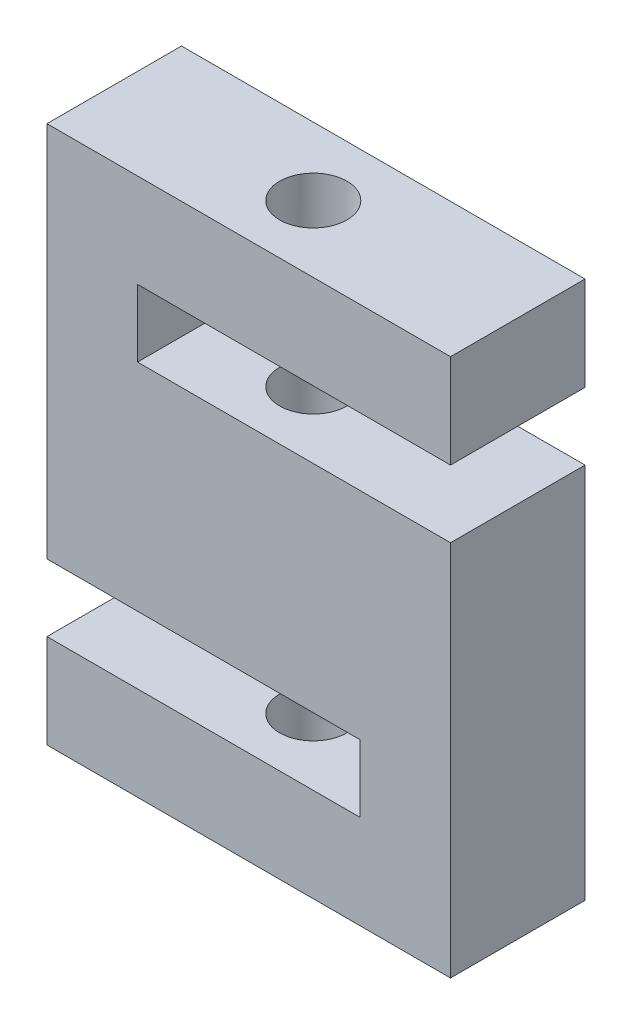
ISO-10303-21;
HEADER;
FILE_DESCRIPTION(('STEP AP214'),'2;1');
FILE_NAME('part.step','',(''),(''),'','','');
FILE_SCHEMA(('AUTOMOTIVE_DESIGN { 1 0 10303 214 1 1 1 1 }'));
ENDSEC;
DATA;
#1=APPLICATION_CONTEXT('core data for automotive mechanical design processes');
#2=APPLICATION_PROTOCOL_DEFINITION('international standard','automotive_design',2000,#1);
#3=PRODUCT_CONTEXT('',#1,'mechanical');
#4=PRODUCT('Part','Part','',(#3));
#5=PRODUCT_RELATED_PRODUCT_CATEGORY('part','',(#4));
#6=PRODUCT_DEFINITION_FORMATION('','',#4);
#7=PRODUCT_DEFINITION_CONTEXT('part definition',#1,'design');
#8=PRODUCT_DEFINITION('design','',#6,#7);
#9=PRODUCT_DEFINITION_SHAPE('','',#8);
#10=(LENGTH_UNIT() NAMED_UNIT(*) SI_UNIT(.MILLI.,.METRE.));
#11=(NAMED_UNIT(*) PLANE_ANGLE_UNIT() SI_UNIT($,.RADIAN.));
#12=(NAMED_UNIT(*) SI_UNIT($,.STERADIAN.) SOLID_ANGLE_UNIT());
#13=UNCERTAINTY_MEASURE_WITH_UNIT(LENGTH_MEASURE(1.E-05),#10,'distance_accuracy_value','');
#14=(GEOMETRIC_REPRESENTATION_CONTEXT(3) GLOBAL_UNCERTAINTY_ASSIGNED_CONTEXT((#13)) GLOBAL_UNIT_ASSIGNED_CONTEXT((#10,
#11,#12)) REPRESENTATION_CONTEXT('',''));
#15=CARTESIAN_POINT('',(0.,0.,0.));
#16=DIRECTION('',(0.,0.,1.));
#17=DIRECTION('',(1.,0.,0.));
#18=AXIS2_PLACEMENT_3D('',#15,#16,#17);
#19=CARTESIAN_POINT('',(0.,23.9572827689821,20.));
#20=DIRECTION('',(1.,0.,0.));
#21=DIRECTION('',(0.,1.,0.));
#22=AXIS2_PLACEMENT_3D('',#19,#20,#21);
#23=PLANE('',#22);
#24=DIRECTION('',(0.,-1.,0.));
#25=VECTOR('',#24,1.);
#26=CARTESIAN_POINT('',(0.,23.9572827689821,0.));
#27=LINE('',#26,#25);
#28=CARTESIAN_POINT('',(0.,80.,0.));
#29=VERTEX_POINT('',#28);
#30=CARTESIAN_POINT('',(0.,23.9572827689821,0.));
#31=VERTEX_POINT('',#30);
#32=EDGE_CURVE('E164',#29,#31,#27,.T.);
#33=ORIENTED_EDGE('',*,*,#32,.T.);
#34=DIRECTION('',(0.,0.,-1.));
#35=VECTOR('',#34,1.);
#36=CARTESIAN_POINT('',(0.,23.9572827689821,20.));
#37=LINE('',#36,#35);
#38=CARTESIAN_POINT('',(0.,23.9572827689821,20.));
#39=VERTEX_POINT('',#38);
#40=EDGE_CURVE('E11',#39,#31,#37,.T.);
#41=ORIENTED_EDGE('',*,*,#40,.F.);
#42=DIRECTION('',(0.,-1.,0.));
#43=VECTOR('',#42,1.);
#44=CARTESIAN_POINT('',(0.,23.9572827689821,20.));
#45=LINE('',#44,#43);
#46=CARTESIAN_POINT('',(0.,80.,20.));
#47=VERTEX_POINT('',#46);
#48=EDGE_CURVE('E199',#47,#39,#45,.T.);
#49=ORIENTED_EDGE('',*,*,#48,.F.);
#50=DIRECTION('',(0.,0.,-1.));
#51=VECTOR('',#50,1.);
#52=CARTESIAN_POINT('',(0.,80.,20.));
#53=LINE('',#52,#51);
#54=EDGE_CURVE('E160',#47,#29,#53,.T.);
#55=ORIENTED_EDGE('',*,*,#54,.T.);
#56=EDGE_LOOP('',(#33,#41,#49,#55));
#57=FACE_BOUND('',#56,.T.);
#58=ADVANCED_FACE('F39',(#57),#23,.F.);
#59=CARTESIAN_POINT('',(46.5297256547318,23.9572827689821,20.));
#60=DIRECTION('',(0.,1.,0.));
#61=DIRECTION('',(-1.,0.,0.));
#62=AXIS2_PLACEMENT_3D('',#59,#60,#61);
#63=PLANE('',#62);
#64=CARTESIAN_POINT('',(29.6974166201863,23.9572827689821,10.1008611266046));
#65=DIRECTION('',(0.,1.,0.));
#66=DIRECTION('',(-1.,0.,0.));
#67=AXIS2_PLACEMENT_3D('',#64,#65,#66);
#68=CIRCLE('',#67,5.);
#69=CARTESIAN_POINT('',(24.6974166201863,23.9572827689821,10.1008611266046));
#70=VERTEX_POINT('',#69);
#71=EDGE_CURVE('E169',#70,#70,#68,.T.);
#72=ORIENTED_EDGE('',*,*,#71,.T.);
#73=EDGE_LOOP('',(#72));
#74=FACE_BOUND('',#73,.T.);
#75=DIRECTION('',(1.,0.,0.));
#76=VECTOR('',#75,1.);
#77=CARTESIAN_POINT('',(46.5297256547318,23.9572827689821,0.));
#78=LINE('',#77,#76);
#79=CARTESIAN_POINT('',(46.5297256547318,23.9572827689821,0.));
#80=VERTEX_POINT('',#79);
#81=EDGE_CURVE('E168',#31,#80,#78,.T.);
#82=ORIENTED_EDGE('',*,*,#81,.T.);
#83=DIRECTION('',(0.,0.,-1.));
#84=VECTOR('',#83,1.);
#85=CARTESIAN_POINT('',(46.5297256547318,23.9572827689821,20.));
#86=LINE('',#85,#84);
#87=CARTESIAN_POINT('',(46.5297256547318,23.9572827689821,20.));
#88=VERTEX_POINT('',#87);
#89=EDGE_CURVE('E48',#88,#80,#86,.T.);
#90=ORIENTED_EDGE('',*,*,#89,.F.);
#91=DIRECTION('',(1.,0.,0.));
#92=VECTOR('',#91,1.);
#93=CARTESIAN_POINT('',(46.5297256547318,23.9572827689821,20.));
#94=LINE('',#93,#92);
#95=EDGE_CURVE('E111',#39,#88,#94,.T.);
#96=ORIENTED_EDGE('',*,*,#95,.F.);
#97=ORIENTED_EDGE('',*,*,#40,.T.);
#98=EDGE_LOOP('',(#82,#90,#96,#97));
#99=FACE_BOUND('',#98,.T.);
#100=ADVANCED_FACE('F295',(#74,#99),#63,.F.);
#101=CARTESIAN_POINT('',(46.5297256547318,13.9572827689821,20.));
#102=DIRECTION('',(1.,0.,0.));
#103=DIRECTION('',(0.,0.,-1.));
#104=AXIS2_PLACEMENT_3D('',#101,#102,#103);
#105=PLANE('',#104);
#106=DIRECTION('',(0.,-1.,0.));
#107=VECTOR('',#106,1.);
#108=CARTESIAN_POINT('',(46.5297256547318,13.9572827689821,0.));
#109=LINE('',#108,#107);
#110=CARTESIAN_POINT('',(46.5297256547318,13.9572827689821,0.));
#111=VERTEX_POINT('',#110);
#112=EDGE_CURVE('E172',#80,#111,#109,.T.);
#113=ORIENTED_EDGE('',*,*,#112,.T.);
#114=DIRECTION('',(0.,0.,-1.));
#115=VECTOR('',#114,1.);
#116=CARTESIAN_POINT('',(46.5297256547318,13.9572827689821,20.));
#117=LINE('',#116,#115);
#118=CARTESIAN_POINT('',(46.5297256547318,13.9572827689821,20.));
#119=VERTEX_POINT('',#118);
#120=EDGE_CURVE('E226',#119,#111,#117,.T.);
#121=ORIENTED_EDGE('',*,*,#120,.F.);
#122=DIRECTION('',(0.,-1.,0.));
#123=VECTOR('',#122,1.);
#124=CARTESIAN_POINT('',(46.5297256547318,13.9572827689821,20.));
#125=LINE('',#124,#123);
#126=EDGE_CURVE('E236',#88,#119,#125,.T.);
#127=ORIENTED_EDGE('',*,*,#126,.F.);
#128=ORIENTED_EDGE('',*,*,#89,.T.);
#129=EDGE_LOOP('',(#113,#121,#127,#128));
#130=FACE_BOUND('',#129,.T.);
#131=ADVANCED_FACE('F234',(#130),#105,.F.);
#132=CARTESIAN_POINT('',(0.,13.9572827689821,20.));
#133=DIRECTION('',(0.,-1.,0.));
#134=DIRECTION('',(0.,0.,-1.));
#135=AXIS2_PLACEMENT_3D('',#132,#133,#134);
#136=PLANE('',#135);
#137=CARTESIAN_POINT('',(29.6974166201863,13.9572827689821,10.1008611266046));
#138=DIRECTION('',(0.,-1.,0.));
#139=DIRECTION('',(0.,0.,-1.));
#140=AXIS2_PLACEMENT_3D('',#137,#138,#139);
#141=CIRCLE('',#140,5.);
#142=CARTESIAN_POINT('',(29.6974166201863,13.9572827689821,5.10086112660456));
#143=VERTEX_POINT('',#142);
#144=EDGE_CURVE('E339',#143,#143,#141,.T.);
#145=ORIENTED_EDGE('',*,*,#144,.T.);
#146=EDGE_LOOP('',(#145));
#147=FACE_BOUND('',#146,.T.);
#148=DIRECTION('',(-1.,0.,0.));
#149=VECTOR('',#148,1.);
#150=CARTESIAN_POINT('',(0.,13.9572827689821,0.));
#151=LINE('',#150,#149);
#152=CARTESIAN_POINT('',(0.,13.9572827689821,0.));
#153=VERTEX_POINT('',#152);
#154=EDGE_CURVE('E175',#111,#153,#151,.T.);
#155=ORIENTED_EDGE('',*,*,#154,.T.);
#156=DIRECTION('',(0.,0.,-1.));
#157=VECTOR('',#156,1.);
#158=CARTESIAN_POINT('',(0.,13.9572827689821,20.));
#159=LINE('',#158,#157);
#160=CARTESIAN_POINT('',(0.,13.9572827689821,20.));
#161=VERTEX_POINT('',#160);
#162=EDGE_CURVE('E222',#161,#153,#159,.T.);
#163=ORIENTED_EDGE('',*,*,#162,.F.);
#164=DIRECTION('',(-1.,0.,0.));
#165=VECTOR('',#164,1.);
#166=CARTESIAN_POINT('',(0.,13.9572827689821,20.));
#167=LINE('',#166,#165);
#168=EDGE_CURVE('E255',#119,#161,#167,.T.);
#169=ORIENTED_EDGE('',*,*,#168,.F.);
#170=ORIENTED_EDGE('',*,*,#120,.T.);
#171=EDGE_LOOP('',(#155,#163,#169,#170));
#172=FACE_BOUND('',#171,.T.);
#173=ADVANCED_FACE('F245',(#147,#172),#136,.F.);
#174=CARTESIAN_POINT('',(0.,0.,20.));
#175=DIRECTION('',(1.,0.,0.));
#176=DIRECTION('',(0.,1.,0.));
#177=AXIS2_PLACEMENT_3D('',#174,#175,#176);
#178=PLANE('',#177);
#179=DIRECTION('',(0.,-1.,0.));
#180=VECTOR('',#179,1.);
#181=CARTESIAN_POINT('',(0.,0.,0.));
#182=LINE('',#181,#180);
#183=CARTESIAN_POINT('',(0.,0.,0.));
#184=VERTEX_POINT('',#183);
#185=EDGE_CURVE('E178',#153,#184,#182,.T.);
#186=ORIENTED_EDGE('',*,*,#185,.T.);
#187=DIRECTION('',(0.,0.,-1.));
#188=VECTOR('',#187,1.);
#189=CARTESIAN_POINT('',(0.,0.,20.));
#190=LINE('',#189,#188);
#191=CARTESIAN_POINT('',(0.,0.,20.));
#192=VERTEX_POINT('',#191);
#193=EDGE_CURVE('E218',#192,#184,#190,.T.);
#194=ORIENTED_EDGE('',*,*,#193,.F.);
#195=DIRECTION('',(0.,-1.,0.));
#196=VECTOR('',#195,1.);
#197=CARTESIAN_POINT('',(0.,0.,20.));
#198=LINE('',#197,#196);
#199=EDGE_CURVE('E251',#161,#192,#198,.T.);
#200=ORIENTED_EDGE('',*,*,#199,.F.);
#201=ORIENTED_EDGE('',*,*,#162,.T.);
#202=EDGE_LOOP('',(#186,#194,#200,#201));
#203=FACE_BOUND('',#202,.T.);
#204=ADVANCED_FACE('F249',(#203),#178,.F.);
#205=CARTESIAN_POINT('',(60.,0.,20.));
#206=DIRECTION('',(0.,1.,0.));
#207=DIRECTION('',(-1.,0.,0.));
#208=AXIS2_PLACEMENT_3D('',#205,#206,#207);
#209=PLANE('',#208);
#210=CARTESIAN_POINT('',(29.6974166201863,0.,10.1008611266046));
#211=DIRECTION('',(0.,1.,0.));
#212=DIRECTION('',(0.,0.,1.));
#213=AXIS2_PLACEMENT_3D('',#210,#211,#212);
#214=CIRCLE('',#213,5.);
#215=CARTESIAN_POINT('',(29.6974166201863,0.,15.1008611266046));
#216=VERTEX_POINT('',#215);
#217=EDGE_CURVE('E334',#216,#216,#214,.T.);
#218=ORIENTED_EDGE('',*,*,#217,.T.);
#219=EDGE_LOOP('',(#218));
#220=FACE_BOUND('',#219,.T.);
#221=DIRECTION('',(1.,0.,0.));
#222=VECTOR('',#221,1.);
#223=CARTESIAN_POINT('',(60.,0.,0.));
#224=LINE('',#223,#222);
#225=CARTESIAN_POINT('',(60.,0.,0.));
#226=VERTEX_POINT('',#225);
#227=EDGE_CURVE('E181',#184,#226,#224,.T.);
#228=ORIENTED_EDGE('',*,*,#227,.T.);
#229=DIRECTION('',(0.,0.,-1.));
#230=VECTOR('',#229,1.);
#231=CARTESIAN_POINT('',(60.,0.,20.));
#232=LINE('',#231,#230);
#233=CARTESIAN_POINT('',(60.,0.,20.));
#234=VERTEX_POINT('',#233);
#235=EDGE_CURVE('E214',#234,#226,#232,.T.);
#236=ORIENTED_EDGE('',*,*,#235,.F.);
#237=DIRECTION('',(1.,0.,0.));
#238=VECTOR('',#237,1.);
#239=CARTESIAN_POINT('',(60.,0.,20.));
#240=LINE('',#239,#238);
#241=EDGE_CURVE('E254',#192,#234,#240,.T.);
#242=ORIENTED_EDGE('',*,*,#241,.F.);
#243=ORIENTED_EDGE('',*,*,#193,.T.);
#244=EDGE_LOOP('',(#228,#236,#242,#243));
#245=FACE_BOUND('',#244,.T.);
#246=ADVANCED_FACE('F311',(#220,#245),#209,.F.);
#247=CARTESIAN_POINT('',(60.,56.0427172310178,20.));
#248=DIRECTION('',(-1.,0.,0.));
#249=DIRECTION('',(0.,-1.,0.));
#250=AXIS2_PLACEMENT_3D('',#247,#248,#249);
#251=PLANE('',#250);
#252=DIRECTION('',(0.,1.,0.));
#253=VECTOR('',#252,1.);
#254=CARTESIAN_POINT('',(60.,56.0427172310178,0.));
#255=LINE('',#254,#253);
#256=CARTESIAN_POINT('',(60.,56.0427172310178,0.));
#257=VERTEX_POINT('',#256);
#258=EDGE_CURVE('E184',#226,#257,#255,.T.);
#259=ORIENTED_EDGE('',*,*,#258,.T.);
#260=DIRECTION('',(0.,0.,-1.));
#261=VECTOR('',#260,1.);
#262=CARTESIAN_POINT('',(60.,56.0427172310178,20.));
#263=LINE('',#262,#261);
#264=CARTESIAN_POINT('',(60.,56.0427172310178,20.));
#265=VERTEX_POINT('',#264);
#266=EDGE_CURVE('E210',#265,#257,#263,.T.);
#267=ORIENTED_EDGE('',*,*,#266,.F.);
#268=DIRECTION('',(0.,1.,0.));
#269=VECTOR('',#268,1.);
#270=CARTESIAN_POINT('',(60.,56.0427172310178,20.));
#271=LINE('',#270,#269);
#272=EDGE_CURVE('E259',#234,#265,#271,.T.);
#273=ORIENTED_EDGE('',*,*,#272,.F.);
#274=ORIENTED_EDGE('',*,*,#235,.T.);
#275=EDGE_LOOP('',(#259,#267,#273,#274));
#276=FACE_BOUND('',#275,.T.);
#277=ADVANCED_FACE('F314',(#276),#251,.F.);
#278=CARTESIAN_POINT('',(13.4702743452682,56.0427172310178,20.));
#279=DIRECTION('',(0.,-1.,0.));
#280=DIRECTION('',(0.,0.,-1.));
#281=AXIS2_PLACEMENT_3D('',#278,#279,#280);
#282=PLANE('',#281);
#283=CARTESIAN_POINT('',(29.6974166201863,56.0427172310178,10.1008611266046));
#284=DIRECTION('',(0.,-1.,0.));
#285=DIRECTION('',(0.,0.,-1.));
#286=AXIS2_PLACEMENT_3D('',#283,#284,#285);
#287=CIRCLE('',#286,5.);
#288=CARTESIAN_POINT('',(29.6974166201863,56.0427172310178,5.10086112660456));
#289=VERTEX_POINT('',#288);
#290=EDGE_CURVE('E333',#289,#289,#287,.T.);
#291=ORIENTED_EDGE('',*,*,#290,.T.);
#292=EDGE_LOOP('',(#291));
#293=FACE_BOUND('',#292,.T.);
#294=DIRECTION('',(-1.,0.,0.));
#295=VECTOR('',#294,1.);
#296=CARTESIAN_POINT('',(13.4702743452682,56.0427172310178,0.));
#297=LINE('',#296,#295);
#298=CARTESIAN_POINT('',(13.4702743452682,56.0427172310178,0.));
#299=VERTEX_POINT('',#298);
#300=EDGE_CURVE('E187',#257,#299,#297,.T.);
#301=ORIENTED_EDGE('',*,*,#300,.T.);
#302=DIRECTION('',(0.,0.,-1.));
#303=VECTOR('',#302,1.);
#304=CARTESIAN_POINT('',(13.4702743452682,56.0427172310178,20.));
#305=LINE('',#304,#303);
#306=CARTESIAN_POINT('',(13.4702743452682,56.0427172310178,20.));
#307=VERTEX_POINT('',#306);
#308=EDGE_CURVE('E206',#307,#299,#305,.T.);
#309=ORIENTED_EDGE('',*,*,#308,.F.);
#310=DIRECTION('',(-1.,0.,0.));
#311=VECTOR('',#310,1.);
#312=CARTESIAN_POINT('',(13.4702743452682,56.0427172310178,20.));
#313=LINE('',#312,#311);
#314=EDGE_CURVE('E266',#265,#307,#313,.T.);
#315=ORIENTED_EDGE('',*,*,#314,.F.);
#316=ORIENTED_EDGE('',*,*,#266,.T.);
#317=EDGE_LOOP('',(#301,#309,#315,#316));
#318=FACE_BOUND('',#317,.T.);
#319=ADVANCED_FACE('F274',(#293,#318),#282,.F.);
#320=CARTESIAN_POINT('',(13.4702743452682,66.0427172310178,20.));
#321=DIRECTION('',(-1.,0.,0.));
#322=DIRECTION('',(0.,-1.,0.));
#323=AXIS2_PLACEMENT_3D('',#320,#321,#322);
#324=PLANE('',#323);
#325=DIRECTION('',(0.,1.,0.));
#326=VECTOR('',#325,1.);
#327=CARTESIAN_POINT('',(13.4702743452682,66.0427172310178,0.));
#328=LINE('',#327,#326);
#329=CARTESIAN_POINT('',(13.4702743452682,66.0427172310178,0.));
#330=VERTEX_POINT('',#329);
#331=EDGE_CURVE('E190',#299,#330,#328,.T.);
#332=ORIENTED_EDGE('',*,*,#331,.T.);
#333=DIRECTION('',(0.,0.,-1.));
#334=VECTOR('',#333,1.);
#335=CARTESIAN_POINT('',(13.4702743452682,66.0427172310178,20.));
#336=LINE('',#335,#334);
#337=CARTESIAN_POINT('',(13.4702743452682,66.0427172310178,20.));
#338=VERTEX_POINT('',#337);
#339=EDGE_CURVE('E153',#338,#330,#336,.T.);
#340=ORIENTED_EDGE('',*,*,#339,.F.);
#341=DIRECTION('',(0.,1.,0.));
#342=VECTOR('',#341,1.);
#343=CARTESIAN_POINT('',(13.4702743452682,66.0427172310178,20.));
#344=LINE('',#343,#342);
#345=EDGE_CURVE('E142',#307,#338,#344,.T.);
#346=ORIENTED_EDGE('',*,*,#345,.F.);
#347=ORIENTED_EDGE('',*,*,#308,.T.);
#348=EDGE_LOOP('',(#332,#340,#346,#347));
#349=FACE_BOUND('',#348,.T.);
#350=ADVANCED_FACE('F278',(#349),#324,.F.);
#351=CARTESIAN_POINT('',(60.,66.0427172310179,20.));
#352=DIRECTION('',(0.,1.,0.));
#353=DIRECTION('',(-1.,0.,0.));
#354=AXIS2_PLACEMENT_3D('',#351,#352,#353);
#355=PLANE('',#354);
#356=CARTESIAN_POINT('',(29.6974166201863,66.0427172310178,10.1008611266046));
#357=DIRECTION('',(0.,1.,0.));
#358=DIRECTION('',(-1.,0.,0.));
#359=AXIS2_PLACEMENT_3D('',#356,#357,#358);
#360=CIRCLE('',#359,5.);
#361=CARTESIAN_POINT('',(24.6974166201863,66.0427172310178,10.1008611266046));
#362=VERTEX_POINT('',#361);
#363=EDGE_CURVE('E330',#362,#362,#360,.T.);
#364=ORIENTED_EDGE('',*,*,#363,.T.);
#365=EDGE_LOOP('',(#364));
#366=FACE_BOUND('',#365,.T.);
#367=DIRECTION('',(1.,0.,0.));
#368=VECTOR('',#367,1.);
#369=CARTESIAN_POINT('',(60.,66.0427172310179,0.));
#370=LINE('',#369,#368);
#371=CARTESIAN_POINT('',(60.,66.0427172310179,0.));
#372=VERTEX_POINT('',#371);
#373=EDGE_CURVE('E151',#330,#372,#370,.T.);
#374=ORIENTED_EDGE('',*,*,#373,.T.);
#375=DIRECTION('',(0.,0.,-1.));
#376=VECTOR('',#375,1.);
#377=CARTESIAN_POINT('',(60.,66.0427172310179,20.));
#378=LINE('',#377,#376);
#379=CARTESIAN_POINT('',(60.,66.0427172310179,20.));
#380=VERTEX_POINT('',#379);
#381=EDGE_CURVE('E148',#380,#372,#378,.T.);
#382=ORIENTED_EDGE('',*,*,#381,.F.);
#383=DIRECTION('',(1.,0.,0.));
#384=VECTOR('',#383,1.);
#385=CARTESIAN_POINT('',(60.,66.0427172310179,20.));
#386=LINE('',#385,#384);
#387=EDGE_CURVE('E136',#338,#380,#386,.T.);
#388=ORIENTED_EDGE('',*,*,#387,.F.);
#389=ORIENTED_EDGE('',*,*,#339,.T.);
#390=EDGE_LOOP('',(#374,#382,#388,#389));
#391=FACE_BOUND('',#390,.T.);
#392=ADVANCED_FACE('F149',(#366,#391),#355,.F.);
#393=CARTESIAN_POINT('',(60.,80.,20.));
#394=DIRECTION('',(-1.,0.,0.));
#395=DIRECTION('',(0.,0.,1.));
#396=AXIS2_PLACEMENT_3D('',#393,#394,#395);
#397=PLANE('',#396);
#398=DIRECTION('',(0.,1.,0.));
#399=VECTOR('',#398,1.);
#400=CARTESIAN_POINT('',(60.,80.,0.));
#401=LINE('',#400,#399);
#402=CARTESIAN_POINT('',(60.,80.,0.));
#403=VERTEX_POINT('',#402);
#404=EDGE_CURVE('E97',#372,#403,#401,.T.);
#405=ORIENTED_EDGE('',*,*,#404,.T.);
#406=DIRECTION('',(0.,0.,-1.));
#407=VECTOR('',#406,1.);
#408=CARTESIAN_POINT('',(60.,80.,20.));
#409=LINE('',#408,#407);
#410=CARTESIAN_POINT('',(60.,80.,20.));
#411=VERTEX_POINT('',#410);
#412=EDGE_CURVE('E154',#411,#403,#409,.T.);
#413=ORIENTED_EDGE('',*,*,#412,.F.);
#414=DIRECTION('',(0.,1.,0.));
#415=VECTOR('',#414,1.);
#416=CARTESIAN_POINT('',(60.,80.,20.));
#417=LINE('',#416,#415);
#418=EDGE_CURVE('E140',#380,#411,#417,.T.);
#419=ORIENTED_EDGE('',*,*,#418,.F.);
#420=ORIENTED_EDGE('',*,*,#381,.T.);
#421=EDGE_LOOP('',(#405,#413,#419,#420));
#422=FACE_BOUND('',#421,.T.);
#423=ADVANCED_FACE('F156',(#422),#397,.F.);
#424=CARTESIAN_POINT('',(0.,80.,20.));
#425=DIRECTION('',(0.,-1.,0.));
#426=DIRECTION('',(0.,0.,-1.));
#427=AXIS2_PLACEMENT_3D('',#424,#425,#426);
#428=PLANE('',#427);
#429=CARTESIAN_POINT('',(29.6974166201863,80.,10.1008611266046));
#430=DIRECTION('',(0.,1.,0.));
#431=DIRECTION('',(0.,0.,1.));
#432=AXIS2_PLACEMENT_3D('',#429,#430,#431);
#433=CIRCLE('',#432,5.);
#434=CARTESIAN_POINT('',(29.6974166201863,80.,15.1008611266046));
#435=VERTEX_POINT('',#434);
#436=EDGE_CURVE('E342',#435,#435,#433,.T.);
#437=ORIENTED_EDGE('',*,*,#436,.F.);
#438=EDGE_LOOP('',(#437));
#439=FACE_BOUND('',#438,.T.);
#440=DIRECTION('',(-1.,0.,0.));
#441=VECTOR('',#440,1.);
#442=CARTESIAN_POINT('',(0.,80.,0.));
#443=LINE('',#442,#441);
#444=EDGE_CURVE('E103',#403,#29,#443,.T.);
#445=ORIENTED_EDGE('',*,*,#444,.T.);
#446=ORIENTED_EDGE('',*,*,#54,.F.);
#447=DIRECTION('',(-1.,0.,0.));
#448=VECTOR('',#447,1.);
#449=CARTESIAN_POINT('',(0.,80.,20.));
#450=LINE('',#449,#448);
#451=EDGE_CURVE('E56',#411,#47,#450,.T.);
#452=ORIENTED_EDGE('',*,*,#451,.F.);
#453=ORIENTED_EDGE('',*,*,#412,.T.);
#454=EDGE_LOOP('',(#445,#446,#452,#453));
#455=FACE_BOUND('',#454,.T.);
#456=ADVANCED_FACE('F282',(#439,#455),#428,.F.);
#457=CARTESIAN_POINT('',(0.,0.,20.));
#458=DIRECTION('',(0.,0.,-1.));
#459=DIRECTION('',(-1.,0.,0.));
#460=AXIS2_PLACEMENT_3D('',#457,#458,#459);
#461=PLANE('',#460);
#462=ORIENTED_EDGE('',*,*,#48,.T.);
#463=ORIENTED_EDGE('',*,*,#95,.T.);
#464=ORIENTED_EDGE('',*,*,#126,.T.);
#465=ORIENTED_EDGE('',*,*,#168,.T.);
#466=ORIENTED_EDGE('',*,*,#199,.T.);
#467=ORIENTED_EDGE('',*,*,#241,.T.);
#468=ORIENTED_EDGE('',*,*,#272,.T.);
#469=ORIENTED_EDGE('',*,*,#314,.T.);
#470=ORIENTED_EDGE('',*,*,#345,.T.);
#471=ORIENTED_EDGE('',*,*,#387,.T.);
#472=ORIENTED_EDGE('',*,*,#418,.T.);
#473=ORIENTED_EDGE('',*,*,#451,.T.);
#474=EDGE_LOOP('',(#462,#463,#464,#465,#466,#467,#468,#469,#470,#471,#472,#473));
#475=FACE_BOUND('',#474,.T.);
#476=ADVANCED_FACE('F138',(#475),#461,.F.);
#477=CARTESIAN_POINT('',(0.,0.,0.));
#478=DIRECTION('',(0.,0.,-1.));
#479=DIRECTION('',(-1.,0.,0.));
#480=AXIS2_PLACEMENT_3D('',#477,#478,#479);
#481=PLANE('',#480);
#482=ORIENTED_EDGE('',*,*,#32,.F.);
#483=ORIENTED_EDGE('',*,*,#444,.F.);
#484=ORIENTED_EDGE('',*,*,#404,.F.);
#485=ORIENTED_EDGE('',*,*,#373,.F.);
#486=ORIENTED_EDGE('',*,*,#331,.F.);
#487=ORIENTED_EDGE('',*,*,#300,.F.);
#488=ORIENTED_EDGE('',*,*,#258,.F.);
#489=ORIENTED_EDGE('',*,*,#227,.F.);
#490=ORIENTED_EDGE('',*,*,#185,.F.);
#491=ORIENTED_EDGE('',*,*,#154,.F.);
#492=ORIENTED_EDGE('',*,*,#112,.F.);
#493=ORIENTED_EDGE('',*,*,#81,.F.);
#494=EDGE_LOOP('',(#482,#483,#484,#485,#486,#487,#488,#489,#490,#491,#492,#493));
#495=FACE_BOUND('',#494,.T.);
#496=ADVANCED_FACE('F240',(#495),#481,.T.);
#497=CARTESIAN_POINT('',(29.6974166201863,0.,10.1008611266046));
#498=DIRECTION('',(0.,1.,0.));
#499=DIRECTION('',(0.,0.,1.));
#500=AXIS2_PLACEMENT_3D('',#497,#498,#499);
#501=CYLINDRICAL_SURFACE('',#500,5.);
#502=ORIENTED_EDGE('',*,*,#436,.T.);
#503=EDGE_LOOP('',(#502));
#504=FACE_BOUND('',#503,.T.);
#505=ORIENTED_EDGE('',*,*,#363,.F.);
#506=EDGE_LOOP('',(#505));
#507=FACE_BOUND('',#506,.T.);
#508=ADVANCED_FACE('F360',(#504,#507),#501,.F.);
#509=ORIENTED_EDGE('',*,*,#290,.F.);
#510=EDGE_LOOP('',(#509));
#511=FACE_BOUND('',#510,.T.);
#512=ORIENTED_EDGE('',*,*,#71,.F.);
#513=EDGE_LOOP('',(#512));
#514=FACE_BOUND('',#513,.T.);
#515=ADVANCED_FACE('F357',(#511,#514),#501,.F.);
#516=ORIENTED_EDGE('',*,*,#217,.F.);
#517=EDGE_LOOP('',(#516));
#518=FACE_BOUND('',#517,.T.);
#519=ORIENTED_EDGE('',*,*,#144,.F.);
#520=EDGE_LOOP('',(#519));
#521=FACE_BOUND('',#520,.T.);
#522=ADVANCED_FACE('F359',(#518,#521),#501,.F.);
#523=CLOSED_SHELL('',(#58,#100,#131,#173,#204,#246,#277,#319,#350,#392,#423,#456,#476,#496,#508,
#515,#522));
#524=MANIFOLD_SOLID_BREP('B2',#523);
#525=ADVANCED_BREP_SHAPE_REPRESENTATION('',(#18,#524),#14);
#526=SHAPE_DEFINITION_REPRESENTATION(#9,#525);
ENDSEC;
END-ISO-10303-21;
